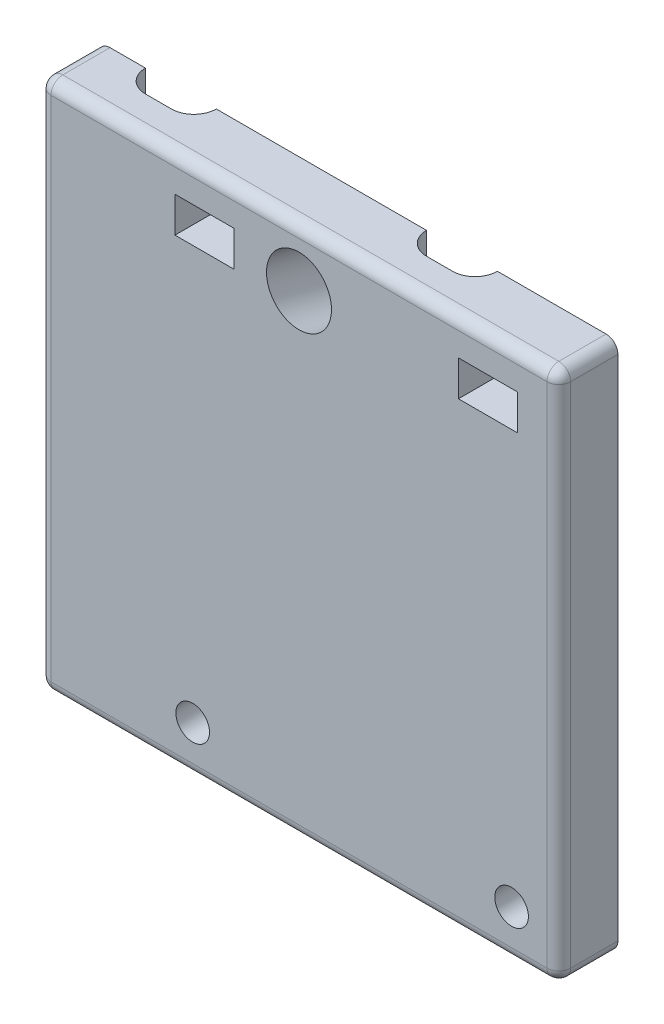
ISO-10303-21;
HEADER;
FILE_DESCRIPTION(('STEP AP214'),'2;1');
FILE_NAME('part.step','',(''),(''),'','','');
FILE_SCHEMA(('AUTOMOTIVE_DESIGN { 1 0 10303 214 1 1 1 1 }'));
ENDSEC;
DATA;
#1=APPLICATION_CONTEXT('core data for automotive mechanical design processes');
#2=APPLICATION_PROTOCOL_DEFINITION('international standard','automotive_design',2000,#1);
#3=PRODUCT_CONTEXT('',#1,'mechanical');
#4=PRODUCT('Part','Part','',(#3));
#5=PRODUCT_RELATED_PRODUCT_CATEGORY('part','',(#4));
#6=PRODUCT_DEFINITION_FORMATION('','',#4);
#7=PRODUCT_DEFINITION_CONTEXT('part definition',#1,'design');
#8=PRODUCT_DEFINITION('design','',#6,#7);
#9=PRODUCT_DEFINITION_SHAPE('','',#8);
#10=(LENGTH_UNIT() NAMED_UNIT(*) SI_UNIT(.MILLI.,.METRE.));
#11=(NAMED_UNIT(*) PLANE_ANGLE_UNIT() SI_UNIT($,.RADIAN.));
#12=(NAMED_UNIT(*) SI_UNIT($,.STERADIAN.) SOLID_ANGLE_UNIT());
#13=UNCERTAINTY_MEASURE_WITH_UNIT(LENGTH_MEASURE(1.E-05),#10,'distance_accuracy_value','');
#14=(GEOMETRIC_REPRESENTATION_CONTEXT(3) GLOBAL_UNCERTAINTY_ASSIGNED_CONTEXT((#13)) GLOBAL_UNIT_ASSIGNED_CONTEXT((#10,
#11,#12)) REPRESENTATION_CONTEXT('',''));
#15=CARTESIAN_POINT('',(0.,0.,0.));
#16=DIRECTION('',(0.,0.,1.));
#17=DIRECTION('',(1.,0.,0.));
#18=AXIS2_PLACEMENT_3D('',#15,#16,#17);
#19=CARTESIAN_POINT('',(0.,0.,0.));
#20=DIRECTION('',(0.,0.,1.));
#21=DIRECTION('',(1.,0.,0.));
#22=AXIS2_PLACEMENT_3D('',#19,#20,#21);
#23=PLANE('',#22);
#24=DIRECTION('',(1.,0.,0.));
#25=VECTOR('',#24,1.);
#26=CARTESIAN_POINT('',(-22.,-22.5,0.));
#27=LINE('',#26,#25);
#28=CARTESIAN_POINT('',(-21.,-22.5,0.));
#29=VERTEX_POINT('',#28);
#30=CARTESIAN_POINT('',(-18.,-22.5,0.));
#31=VERTEX_POINT('',#30);
#32=EDGE_CURVE('E356',#29,#31,#27,.T.);
#33=ORIENTED_EDGE('',*,*,#32,.F.);
#34=CARTESIAN_POINT('',(-21.,-21.5,0.));
#35=DIRECTION('',(0.,0.,1.));
#36=DIRECTION('',(1.,0.,0.));
#37=AXIS2_PLACEMENT_3D('',#34,#35,#36);
#38=CIRCLE('',#37,1.);
#39=CARTESIAN_POINT('',(-22.,-21.5,0.));
#40=VERTEX_POINT('',#39);
#41=EDGE_CURVE('E11',#29,#40,#38,.F.);
#42=ORIENTED_EDGE('',*,*,#41,.T.);
#43=DIRECTION('',(0.,-1.,0.));
#44=VECTOR('',#43,1.);
#45=CARTESIAN_POINT('',(-22.,22.5,0.));
#46=LINE('',#45,#44);
#47=CARTESIAN_POINT('',(-22.,21.5,0.));
#48=VERTEX_POINT('',#47);
#49=EDGE_CURVE('E351',#48,#40,#46,.T.);
#50=ORIENTED_EDGE('',*,*,#49,.F.);
#51=CARTESIAN_POINT('',(-21.,21.5,0.));
#52=DIRECTION('',(0.,0.,1.));
#53=DIRECTION('',(1.,0.,0.));
#54=AXIS2_PLACEMENT_3D('',#51,#52,#53);
#55=CIRCLE('',#54,1.);
#56=CARTESIAN_POINT('',(-21.,22.5,0.));
#57=VERTEX_POINT('',#56);
#58=EDGE_CURVE('E45',#48,#57,#55,.F.);
#59=ORIENTED_EDGE('',*,*,#58,.T.);
#60=DIRECTION('',(-1.,0.,0.));
#61=VECTOR('',#60,1.);
#62=CARTESIAN_POINT('',(-22.,22.5,0.));
#63=LINE('',#62,#61);
#64=CARTESIAN_POINT('',(-18.,22.5,0.));
#65=VERTEX_POINT('',#64);
#66=EDGE_CURVE('E348',#65,#57,#63,.T.);
#67=ORIENTED_EDGE('',*,*,#66,.F.);
#68=DIRECTION('',(0.,1.,0.));
#69=VECTOR('',#68,1.);
#70=CARTESIAN_POINT('',(-18.,-22.5,0.));
#71=LINE('',#70,#69);
#72=EDGE_CURVE('E312',#31,#65,#71,.T.);
#73=ORIENTED_EDGE('',*,*,#72,.F.);
#74=EDGE_LOOP('',(#33,#42,#50,#59,#67,#73));
#75=FACE_BOUND('',#74,.T.);
#76=ADVANCED_FACE('F36',(#75),#23,.F.);
#77=CARTESIAN_POINT('',(18.,-18.5,0.));
#78=DIRECTION('',(0.,0.,-1.));
#79=DIRECTION('',(-1.,0.,0.));
#80=AXIS2_PLACEMENT_3D('',#77,#78,#79);
#81=CIRCLE('',#80,1.425);
#82=CARTESIAN_POINT('',(16.575,-18.5,0.));
#83=VERTEX_POINT('',#82);
#84=EDGE_CURVE('E437',#83,#83,#81,.T.);
#85=ORIENTED_EDGE('',*,*,#84,.F.);
#86=EDGE_LOOP('',(#85));
#87=FACE_BOUND('',#86,.T.);
#88=DIRECTION('',(1.,0.,0.));
#89=VECTOR('',#88,1.);
#90=CARTESIAN_POINT('',(18.5,19.5,0.));
#91=LINE('',#90,#89);
#92=CARTESIAN_POINT('',(13.5,19.5,0.));
#93=VERTEX_POINT('',#92);
#94=CARTESIAN_POINT('',(18.5,19.5,0.));
#95=VERTEX_POINT('',#94);
#96=EDGE_CURVE('E275',#93,#95,#91,.T.);
#97=ORIENTED_EDGE('',*,*,#96,.F.);
#98=DIRECTION('',(0.,1.,0.));
#99=VECTOR('',#98,1.);
#100=CARTESIAN_POINT('',(13.5,19.5,0.));
#101=LINE('',#100,#99);
#102=CARTESIAN_POINT('',(13.5,16.5,0.));
#103=VERTEX_POINT('',#102);
#104=EDGE_CURVE('E247',#103,#93,#101,.T.);
#105=ORIENTED_EDGE('',*,*,#104,.F.);
#106=DIRECTION('',(-1.,0.,0.));
#107=VECTOR('',#106,1.);
#108=CARTESIAN_POINT('',(18.5,16.5,0.));
#109=LINE('',#108,#107);
#110=CARTESIAN_POINT('',(18.5,16.5,0.));
#111=VERTEX_POINT('',#110);
#112=EDGE_CURVE('E268',#111,#103,#109,.T.);
#113=ORIENTED_EDGE('',*,*,#112,.F.);
#114=DIRECTION('',(0.,-1.,0.));
#115=VECTOR('',#114,1.);
#116=CARTESIAN_POINT('',(18.5,19.5,0.));
#117=LINE('',#116,#115);
#118=EDGE_CURVE('E271',#95,#111,#117,.T.);
#119=ORIENTED_EDGE('',*,*,#118,.F.);
#120=EDGE_LOOP('',(#97,#105,#113,#119));
#121=FACE_BOUND('',#120,.T.);
#122=CARTESIAN_POINT('',(21.,22.5,0.));
#123=VERTEX_POINT('',#122);
#124=CARTESIAN_POINT('',(11.8,22.5,0.));
#125=VERTEX_POINT('',#124);
#126=EDGE_CURVE('E349',#123,#125,#63,.T.);
#127=ORIENTED_EDGE('',*,*,#126,.F.);
#128=CARTESIAN_POINT('',(21.,21.5,0.));
#129=DIRECTION('',(0.,0.,1.));
#130=DIRECTION('',(1.,0.,0.));
#131=AXIS2_PLACEMENT_3D('',#128,#129,#130);
#132=CIRCLE('',#131,1.);
#133=CARTESIAN_POINT('',(22.,21.5,0.));
#134=VERTEX_POINT('',#133);
#135=EDGE_CURVE('E395',#123,#134,#132,.F.);
#136=ORIENTED_EDGE('',*,*,#135,.T.);
#137=DIRECTION('',(0.,1.,0.));
#138=VECTOR('',#137,1.);
#139=CARTESIAN_POINT('',(22.,22.5,0.));
#140=LINE('',#139,#138);
#141=CARTESIAN_POINT('',(22.,-21.5,0.));
#142=VERTEX_POINT('',#141);
#143=EDGE_CURVE('E314',#142,#134,#140,.T.);
#144=ORIENTED_EDGE('',*,*,#143,.F.);
#145=CARTESIAN_POINT('',(21.,-21.5,0.));
#146=DIRECTION('',(0.,0.,1.));
#147=DIRECTION('',(1.,0.,0.));
#148=AXIS2_PLACEMENT_3D('',#145,#146,#147);
#149=CIRCLE('',#148,1.);
#150=CARTESIAN_POINT('',(21.,-22.5,0.));
#151=VERTEX_POINT('',#150);
#152=EDGE_CURVE('E393',#142,#151,#149,.F.);
#153=ORIENTED_EDGE('',*,*,#152,.T.);
#154=CARTESIAN_POINT('',(11.8,-22.5,0.));
#155=VERTEX_POINT('',#154);
#156=EDGE_CURVE('E355',#155,#151,#27,.T.);
#157=ORIENTED_EDGE('',*,*,#156,.F.);
#158=DIRECTION('',(0.,1.,0.));
#159=VECTOR('',#158,1.);
#160=CARTESIAN_POINT('',(11.8,-22.5,0.));
#161=LINE('',#160,#159);
#162=EDGE_CURVE('E321',#155,#125,#161,.T.);
#163=ORIENTED_EDGE('',*,*,#162,.T.);
#164=EDGE_LOOP('',(#127,#136,#144,#153,#157,#163));
#165=FACE_BOUND('',#164,.T.);
#166=ADVANCED_FACE('F454',(#87,#121,#165),#23,.F.);
#167=CARTESIAN_POINT('',(22.,22.5,5.));
#168=DIRECTION('',(-1.,0.,0.));
#169=DIRECTION('',(0.,-1.,0.));
#170=AXIS2_PLACEMENT_3D('',#167,#168,#169);
#171=PLANE('',#170);
#172=ORIENTED_EDGE('',*,*,#143,.T.);
#173=DIRECTION('',(0.,0.,-1.));
#174=VECTOR('',#173,1.);
#175=CARTESIAN_POINT('',(22.,21.5,5.));
#176=LINE('',#175,#174);
#177=CARTESIAN_POINT('',(22.,21.5,4.));
#178=VERTEX_POINT('',#177);
#179=EDGE_CURVE('E381',#134,#178,#176,.F.);
#180=ORIENTED_EDGE('',*,*,#179,.T.);
#181=DIRECTION('',(0.,1.,0.));
#182=VECTOR('',#181,1.);
#183=CARTESIAN_POINT('',(22.,-22.5,4.));
#184=LINE('',#183,#182);
#185=CARTESIAN_POINT('',(22.,-21.5,4.));
#186=VERTEX_POINT('',#185);
#187=EDGE_CURVE('E379',#178,#186,#184,.F.);
#188=ORIENTED_EDGE('',*,*,#187,.T.);
#189=DIRECTION('',(0.,0.,-1.));
#190=VECTOR('',#189,1.);
#191=CARTESIAN_POINT('',(22.,-21.5,5.));
#192=LINE('',#191,#190);
#193=EDGE_CURVE('E377',#186,#142,#192,.T.);
#194=ORIENTED_EDGE('',*,*,#193,.T.);
#195=EDGE_LOOP('',(#172,#180,#188,#194));
#196=FACE_BOUND('',#195,.T.);
#197=ADVANCED_FACE('F457',(#196),#171,.F.);
#198=CARTESIAN_POINT('',(-22.,22.5,5.));
#199=DIRECTION('',(0.,-1.,0.));
#200=DIRECTION('',(0.,0.,-1.));
#201=AXIS2_PLACEMENT_3D('',#198,#199,#200);
#202=PLANE('',#201);
#203=DIRECTION('',(-1.,0.,0.));
#204=VECTOR('',#203,1.);
#205=CARTESIAN_POINT('',(22.,22.5,4.));
#206=LINE('',#205,#204);
#207=CARTESIAN_POINT('',(-21.,22.5,4.));
#208=VERTEX_POINT('',#207);
#209=CARTESIAN_POINT('',(21.,22.5,4.));
#210=VERTEX_POINT('',#209);
#211=EDGE_CURVE('E53',#208,#210,#206,.F.);
#212=ORIENTED_EDGE('',*,*,#211,.T.);
#213=DIRECTION('',(0.,0.,-1.));
#214=VECTOR('',#213,1.);
#215=CARTESIAN_POINT('',(21.,22.5,5.));
#216=LINE('',#215,#214);
#217=EDGE_CURVE('E391',#210,#123,#216,.T.);
#218=ORIENTED_EDGE('',*,*,#217,.T.);
#219=ORIENTED_EDGE('',*,*,#126,.T.);
#220=CARTESIAN_POINT('',(9.9,22.5,0.));
#221=DIRECTION('',(0.,1.,0.));
#222=DIRECTION('',(0.,0.,1.));
#223=AXIS2_PLACEMENT_3D('',#220,#221,#222);
#224=CIRCLE('',#223,1.9);
#225=CARTESIAN_POINT('',(9.9,22.5,1.9));
#226=VERTEX_POINT('',#225);
#227=EDGE_CURVE('E308',#226,#125,#224,.T.);
#228=ORIENTED_EDGE('',*,*,#227,.F.);
#229=DIRECTION('',(1.,0.,0.));
#230=VECTOR('',#229,1.);
#231=CARTESIAN_POINT('',(9.9,22.5,1.9));
#232=LINE('',#231,#230);
#233=CARTESIAN_POINT('',(7.7,22.5,1.9));
#234=VERTEX_POINT('',#233);
#235=EDGE_CURVE('E330',#234,#226,#232,.T.);
#236=ORIENTED_EDGE('',*,*,#235,.F.);
#237=CARTESIAN_POINT('',(7.7,22.5,0.));
#238=DIRECTION('',(0.,1.,0.));
#239=DIRECTION('',(0.,0.,1.));
#240=AXIS2_PLACEMENT_3D('',#237,#238,#239);
#241=CIRCLE('',#240,1.9);
#242=CARTESIAN_POINT('',(5.8,22.5,0.));
#243=VERTEX_POINT('',#242);
#244=EDGE_CURVE('E333',#243,#234,#241,.T.);
#245=ORIENTED_EDGE('',*,*,#244,.F.);
#246=CARTESIAN_POINT('',(-12.,22.5,0.));
#247=VERTEX_POINT('',#246);
#248=EDGE_CURVE('E352',#243,#247,#63,.T.);
#249=ORIENTED_EDGE('',*,*,#248,.T.);
#250=CARTESIAN_POINT('',(-13.9,22.5,0.));
#251=DIRECTION('',(0.,1.,0.));
#252=DIRECTION('',(0.,0.,-1.));
#253=AXIS2_PLACEMENT_3D('',#250,#251,#252);
#254=CIRCLE('',#253,1.9);
#255=CARTESIAN_POINT('',(-13.9,22.5,1.9));
#256=VERTEX_POINT('',#255);
#257=EDGE_CURVE('E297',#256,#247,#254,.T.);
#258=ORIENTED_EDGE('',*,*,#257,.F.);
#259=DIRECTION('',(1.,0.,0.));
#260=VECTOR('',#259,1.);
#261=CARTESIAN_POINT('',(-16.1,22.5,1.9));
#262=LINE('',#261,#260);
#263=CARTESIAN_POINT('',(-16.1,22.5,1.9));
#264=VERTEX_POINT('',#263);
#265=EDGE_CURVE('E307',#264,#256,#262,.T.);
#266=ORIENTED_EDGE('',*,*,#265,.F.);
#267=CARTESIAN_POINT('',(-16.1,22.5,0.));
#268=DIRECTION('',(0.,1.,0.));
#269=DIRECTION('',(0.,0.,-1.));
#270=AXIS2_PLACEMENT_3D('',#267,#268,#269);
#271=CIRCLE('',#270,1.9);
#272=EDGE_CURVE('E304',#65,#264,#271,.T.);
#273=ORIENTED_EDGE('',*,*,#272,.F.);
#274=ORIENTED_EDGE('',*,*,#66,.T.);
#275=DIRECTION('',(0.,0.,-1.));
#276=VECTOR('',#275,1.);
#277=CARTESIAN_POINT('',(-21.,22.5,5.));
#278=LINE('',#277,#276);
#279=EDGE_CURVE('E58',#57,#208,#278,.F.);
#280=ORIENTED_EDGE('',*,*,#279,.T.);
#281=EDGE_LOOP('',(#212,#218,#219,#228,#236,#245,#249,#258,#266,#273,#274,#280));
#282=FACE_BOUND('',#281,.T.);
#283=ADVANCED_FACE('F502',(#282),#202,.F.);
#284=CARTESIAN_POINT('',(-22.,22.5,5.));
#285=DIRECTION('',(1.,0.,0.));
#286=DIRECTION('',(0.,1.,0.));
#287=AXIS2_PLACEMENT_3D('',#284,#285,#286);
#288=PLANE('',#287);
#289=ORIENTED_EDGE('',*,*,#49,.T.);
#290=DIRECTION('',(0.,0.,-1.));
#291=VECTOR('',#290,1.);
#292=CARTESIAN_POINT('',(-22.,-21.5,5.));
#293=LINE('',#292,#291);
#294=CARTESIAN_POINT('',(-22.,-21.5,4.));
#295=VERTEX_POINT('',#294);
#296=EDGE_CURVE('E375',#40,#295,#293,.F.);
#297=ORIENTED_EDGE('',*,*,#296,.T.);
#298=DIRECTION('',(0.,-1.,0.));
#299=VECTOR('',#298,1.);
#300=CARTESIAN_POINT('',(-22.,22.5,4.));
#301=LINE('',#300,#299);
#302=CARTESIAN_POINT('',(-22.,21.5,4.));
#303=VERTEX_POINT('',#302);
#304=EDGE_CURVE('E372',#295,#303,#301,.F.);
#305=ORIENTED_EDGE('',*,*,#304,.T.);
#306=DIRECTION('',(0.,0.,-1.));
#307=VECTOR('',#306,1.);
#308=CARTESIAN_POINT('',(-22.,21.5,5.));
#309=LINE('',#308,#307);
#310=EDGE_CURVE('E370',#303,#48,#309,.T.);
#311=ORIENTED_EDGE('',*,*,#310,.T.);
#312=EDGE_LOOP('',(#289,#297,#305,#311));
#313=FACE_BOUND('',#312,.T.);
#314=ADVANCED_FACE('F528',(#313),#288,.F.);
#315=CARTESIAN_POINT('',(-22.,-22.5,5.));
#316=DIRECTION('',(0.,1.,0.));
#317=DIRECTION('',(0.,0.,1.));
#318=AXIS2_PLACEMENT_3D('',#315,#316,#317);
#319=PLANE('',#318);
#320=ORIENTED_EDGE('',*,*,#156,.T.);
#321=DIRECTION('',(0.,0.,-1.));
#322=VECTOR('',#321,1.);
#323=CARTESIAN_POINT('',(21.,-22.5,5.));
#324=LINE('',#323,#322);
#325=CARTESIAN_POINT('',(21.,-22.5,4.));
#326=VERTEX_POINT('',#325);
#327=EDGE_CURVE('E387',#151,#326,#324,.F.);
#328=ORIENTED_EDGE('',*,*,#327,.T.);
#329=DIRECTION('',(1.,0.,0.));
#330=VECTOR('',#329,1.);
#331=CARTESIAN_POINT('',(-22.,-22.5,4.));
#332=LINE('',#331,#330);
#333=CARTESIAN_POINT('',(-21.,-22.5,4.));
#334=VERTEX_POINT('',#333);
#335=EDGE_CURVE('E385',#326,#334,#332,.F.);
#336=ORIENTED_EDGE('',*,*,#335,.T.);
#337=DIRECTION('',(0.,0.,-1.));
#338=VECTOR('',#337,1.);
#339=CARTESIAN_POINT('',(-21.,-22.5,5.));
#340=LINE('',#339,#338);
#341=EDGE_CURVE('E383',#334,#29,#340,.T.);
#342=ORIENTED_EDGE('',*,*,#341,.T.);
#343=ORIENTED_EDGE('',*,*,#32,.T.);
#344=CARTESIAN_POINT('',(-16.1,-22.5,0.));
#345=DIRECTION('',(0.,1.,0.));
#346=DIRECTION('',(0.,0.,-1.));
#347=AXIS2_PLACEMENT_3D('',#344,#345,#346);
#348=CIRCLE('',#347,1.9);
#349=CARTESIAN_POINT('',(-16.1,-22.5,1.9));
#350=VERTEX_POINT('',#349);
#351=EDGE_CURVE('E293',#31,#350,#348,.T.);
#352=ORIENTED_EDGE('',*,*,#351,.T.);
#353=DIRECTION('',(1.,0.,0.));
#354=VECTOR('',#353,1.);
#355=CARTESIAN_POINT('',(-16.1,-22.5,1.9));
#356=LINE('',#355,#354);
#357=CARTESIAN_POINT('',(-13.9,-22.5,1.9));
#358=VERTEX_POINT('',#357);
#359=EDGE_CURVE('E296',#350,#358,#356,.T.);
#360=ORIENTED_EDGE('',*,*,#359,.T.);
#361=CARTESIAN_POINT('',(-13.9,-22.5,0.));
#362=DIRECTION('',(0.,1.,0.));
#363=DIRECTION('',(0.,0.,-1.));
#364=AXIS2_PLACEMENT_3D('',#361,#362,#363);
#365=CIRCLE('',#364,1.9);
#366=CARTESIAN_POINT('',(-12.,-22.5,0.));
#367=VERTEX_POINT('',#366);
#368=EDGE_CURVE('E300',#358,#367,#365,.T.);
#369=ORIENTED_EDGE('',*,*,#368,.T.);
#370=CARTESIAN_POINT('',(5.8,-22.5,0.));
#371=VERTEX_POINT('',#370);
#372=EDGE_CURVE('E359',#367,#371,#27,.T.);
#373=ORIENTED_EDGE('',*,*,#372,.T.);
#374=CARTESIAN_POINT('',(7.7,-22.5,0.));
#375=DIRECTION('',(0.,1.,0.));
#376=DIRECTION('',(0.,0.,1.));
#377=AXIS2_PLACEMENT_3D('',#374,#375,#376);
#378=CIRCLE('',#377,1.9);
#379=CARTESIAN_POINT('',(7.7,-22.5,1.9));
#380=VERTEX_POINT('',#379);
#381=EDGE_CURVE('E341',#371,#380,#378,.T.);
#382=ORIENTED_EDGE('',*,*,#381,.T.);
#383=DIRECTION('',(1.,0.,0.));
#384=VECTOR('',#383,1.);
#385=CARTESIAN_POINT('',(9.9,-22.5,1.9));
#386=LINE('',#385,#384);
#387=CARTESIAN_POINT('',(9.9,-22.5,1.9));
#388=VERTEX_POINT('',#387);
#389=EDGE_CURVE('E324',#380,#388,#386,.T.);
#390=ORIENTED_EDGE('',*,*,#389,.T.);
#391=CARTESIAN_POINT('',(9.9,-22.5,0.));
#392=DIRECTION('',(0.,1.,0.));
#393=DIRECTION('',(0.,0.,1.));
#394=AXIS2_PLACEMENT_3D('',#391,#392,#393);
#395=CIRCLE('',#394,1.9);
#396=EDGE_CURVE('E334',#388,#155,#395,.T.);
#397=ORIENTED_EDGE('',*,*,#396,.T.);
#398=EDGE_LOOP('',(#320,#328,#336,#342,#343,#352,#360,#369,#373,#382,#390,#397));
#399=FACE_BOUND('',#398,.T.);
#400=ADVANCED_FACE('F489',(#399),#319,.F.);
#401=CARTESIAN_POINT('',(0.,0.,5.));
#402=DIRECTION('',(0.,0.,1.));
#403=DIRECTION('',(1.,0.,0.));
#404=AXIS2_PLACEMENT_3D('',#401,#402,#403);
#405=PLANE('',#404);
#406=DIRECTION('',(0.,-1.,0.));
#407=VECTOR('',#406,1.);
#408=CARTESIAN_POINT('',(-21.,-22.5,5.));
#409=LINE('',#408,#407);
#410=CARTESIAN_POINT('',(-21.,21.5,5.));
#411=VERTEX_POINT('',#410);
#412=CARTESIAN_POINT('',(-21.,-21.5,5.));
#413=VERTEX_POINT('',#412);
#414=EDGE_CURVE('E365',#411,#413,#409,.T.);
#415=ORIENTED_EDGE('',*,*,#414,.T.);
#416=DIRECTION('',(1.,0.,0.));
#417=VECTOR('',#416,1.);
#418=CARTESIAN_POINT('',(22.,-21.5,5.));
#419=LINE('',#418,#417);
#420=CARTESIAN_POINT('',(21.,-21.5,5.));
#421=VERTEX_POINT('',#420);
#422=EDGE_CURVE('E368',#413,#421,#419,.T.);
#423=ORIENTED_EDGE('',*,*,#422,.T.);
#424=DIRECTION('',(0.,1.,0.));
#425=VECTOR('',#424,1.);
#426=CARTESIAN_POINT('',(21.,22.5,5.));
#427=LINE('',#426,#425);
#428=CARTESIAN_POINT('',(21.,21.5,5.));
#429=VERTEX_POINT('',#428);
#430=EDGE_CURVE('E363',#421,#429,#427,.T.);
#431=ORIENTED_EDGE('',*,*,#430,.T.);
#432=DIRECTION('',(-1.,0.,0.));
#433=VECTOR('',#432,1.);
#434=CARTESIAN_POINT('',(-22.,21.5,5.));
#435=LINE('',#434,#433);
#436=EDGE_CURVE('E358',#429,#411,#435,.T.);
#437=ORIENTED_EDGE('',*,*,#436,.T.);
#438=EDGE_LOOP('',(#415,#423,#431,#437));
#439=FACE_BOUND('',#438,.T.);
#440=CARTESIAN_POINT('',(18.,-18.5,5.));
#441=DIRECTION('',(0.,0.,-1.));
#442=DIRECTION('',(-1.,0.,0.));
#443=AXIS2_PLACEMENT_3D('',#440,#441,#442);
#444=CIRCLE('',#443,1.425);
#445=CARTESIAN_POINT('',(16.575,-18.5,5.));
#446=VERTEX_POINT('',#445);
#447=EDGE_CURVE('E267',#446,#446,#444,.T.);
#448=ORIENTED_EDGE('',*,*,#447,.T.);
#449=EDGE_LOOP('',(#448));
#450=FACE_BOUND('',#449,.T.);
#451=CARTESIAN_POINT('',(-9.00000000000001,-18.5,5.));
#452=DIRECTION('',(0.,0.,-1.));
#453=DIRECTION('',(1.,0.,0.));
#454=AXIS2_PLACEMENT_3D('',#451,#452,#453);
#455=CIRCLE('',#454,1.425);
#456=CARTESIAN_POINT('',(-7.57500000000001,-18.5,5.));
#457=VERTEX_POINT('',#456);
#458=EDGE_CURVE('E240',#457,#457,#455,.T.);
#459=ORIENTED_EDGE('',*,*,#458,.T.);
#460=EDGE_LOOP('',(#459));
#461=FACE_BOUND('',#460,.T.);
#462=DIRECTION('',(0.,1.,0.));
#463=VECTOR('',#462,1.);
#464=CARTESIAN_POINT('',(-10.5,19.5,5.));
#465=LINE('',#464,#463);
#466=CARTESIAN_POINT('',(-10.5,16.5,5.));
#467=VERTEX_POINT('',#466);
#468=CARTESIAN_POINT('',(-10.5,19.5,5.));
#469=VERTEX_POINT('',#468);
#470=EDGE_CURVE('E213',#467,#469,#465,.T.);
#471=ORIENTED_EDGE('',*,*,#470,.T.);
#472=DIRECTION('',(1.,0.,0.));
#473=VECTOR('',#472,1.);
#474=CARTESIAN_POINT('',(-10.5,19.5,5.));
#475=LINE('',#474,#473);
#476=CARTESIAN_POINT('',(-5.5,19.5,5.));
#477=VERTEX_POINT('',#476);
#478=EDGE_CURVE('E225',#469,#477,#475,.T.);
#479=ORIENTED_EDGE('',*,*,#478,.T.);
#480=DIRECTION('',(0.,-1.,0.));
#481=VECTOR('',#480,1.);
#482=CARTESIAN_POINT('',(-5.5,19.5,5.));
#483=LINE('',#482,#481);
#484=CARTESIAN_POINT('',(-5.5,16.5,5.));
#485=VERTEX_POINT('',#484);
#486=EDGE_CURVE('E229',#477,#485,#483,.T.);
#487=ORIENTED_EDGE('',*,*,#486,.T.);
#488=DIRECTION('',(-1.,0.,0.));
#489=VECTOR('',#488,1.);
#490=CARTESIAN_POINT('',(-10.5,16.5,5.));
#491=LINE('',#490,#489);
#492=EDGE_CURVE('E221',#485,#467,#491,.T.);
#493=ORIENTED_EDGE('',*,*,#492,.T.);
#494=EDGE_LOOP('',(#471,#479,#487,#493));
#495=FACE_BOUND('',#494,.T.);
#496=DIRECTION('',(0.,1.,0.));
#497=VECTOR('',#496,1.);
#498=CARTESIAN_POINT('',(13.5,19.5,5.));
#499=LINE('',#498,#497);
#500=CARTESIAN_POINT('',(13.5,16.5,5.));
#501=VERTEX_POINT('',#500);
#502=CARTESIAN_POINT('',(13.5,19.5,5.));
#503=VERTEX_POINT('',#502);
#504=EDGE_CURVE('E272',#501,#503,#499,.T.);
#505=ORIENTED_EDGE('',*,*,#504,.T.);
#506=DIRECTION('',(1.,0.,0.));
#507=VECTOR('',#506,1.);
#508=CARTESIAN_POINT('',(18.5,19.5,5.));
#509=LINE('',#508,#507);
#510=CARTESIAN_POINT('',(18.5,19.5,5.));
#511=VERTEX_POINT('',#510);
#512=EDGE_CURVE('E284',#503,#511,#509,.T.);
#513=ORIENTED_EDGE('',*,*,#512,.T.);
#514=DIRECTION('',(0.,-1.,0.));
#515=VECTOR('',#514,1.);
#516=CARTESIAN_POINT('',(18.5,19.5,5.));
#517=LINE('',#516,#515);
#518=CARTESIAN_POINT('',(18.5,16.5,5.));
#519=VERTEX_POINT('',#518);
#520=EDGE_CURVE('E281',#511,#519,#517,.T.);
#521=ORIENTED_EDGE('',*,*,#520,.T.);
#522=DIRECTION('',(-1.,0.,0.));
#523=VECTOR('',#522,1.);
#524=CARTESIAN_POINT('',(18.5,16.5,5.));
#525=LINE('',#524,#523);
#526=EDGE_CURVE('E260',#519,#501,#525,.T.);
#527=ORIENTED_EDGE('',*,*,#526,.T.);
#528=EDGE_LOOP('',(#505,#513,#521,#527));
#529=FACE_BOUND('',#528,.T.);
#530=CARTESIAN_POINT('',(0.,17.6582599334208,5.));
#531=DIRECTION('',(0.,0.,1.));
#532=DIRECTION('',(0.,-1.,0.));
#533=AXIS2_PLACEMENT_3D('',#530,#531,#532);
#534=ELLIPSE('',#533,2.84700949612773,2.75);
#535=CARTESIAN_POINT('',(0.,14.8112504372931,5.));
#536=VERTEX_POINT('',#535);
#537=EDGE_CURVE('E289',#536,#536,#534,.T.);
#538=ORIENTED_EDGE('',*,*,#537,.F.);
#539=EDGE_LOOP('',(#538));
#540=FACE_BOUND('',#539,.T.);
#541=ADVANCED_FACE('F231',(#439,#450,#461,#495,#529,#540),#405,.T.);
#542=CARTESIAN_POINT('',(-9.00000000000001,-18.5,0.));
#543=DIRECTION('',(0.,0.,-1.));
#544=DIRECTION('',(1.,0.,0.));
#545=AXIS2_PLACEMENT_3D('',#542,#543,#544);
#546=CIRCLE('',#545,1.425);
#547=CARTESIAN_POINT('',(-7.57500000000001,-18.5,0.));
#548=VERTEX_POINT('',#547);
#549=EDGE_CURVE('E433',#548,#548,#546,.T.);
#550=ORIENTED_EDGE('',*,*,#549,.F.);
#551=EDGE_LOOP('',(#550));
#552=FACE_BOUND('',#551,.T.);
#553=DIRECTION('',(1.,0.,0.));
#554=VECTOR('',#553,1.);
#555=CARTESIAN_POINT('',(-10.5,19.5,0.));
#556=LINE('',#555,#554);
#557=CARTESIAN_POINT('',(-10.5,19.5,0.));
#558=VERTEX_POINT('',#557);
#559=CARTESIAN_POINT('',(-5.5,19.5,0.));
#560=VERTEX_POINT('',#559);
#561=EDGE_CURVE('E246',#558,#560,#556,.T.);
#562=ORIENTED_EDGE('',*,*,#561,.F.);
#563=DIRECTION('',(0.,1.,0.));
#564=VECTOR('',#563,1.);
#565=CARTESIAN_POINT('',(-10.5,19.5,0.));
#566=LINE('',#565,#564);
#567=CARTESIAN_POINT('',(-10.5,16.5,0.));
#568=VERTEX_POINT('',#567);
#569=EDGE_CURVE('E216',#568,#558,#566,.T.);
#570=ORIENTED_EDGE('',*,*,#569,.F.);
#571=DIRECTION('',(-1.,0.,0.));
#572=VECTOR('',#571,1.);
#573=CARTESIAN_POINT('',(-10.5,16.5,0.));
#574=LINE('',#573,#572);
#575=CARTESIAN_POINT('',(-5.5,16.5,0.));
#576=VERTEX_POINT('',#575);
#577=EDGE_CURVE('E234',#576,#568,#574,.T.);
#578=ORIENTED_EDGE('',*,*,#577,.F.);
#579=DIRECTION('',(0.,-1.,0.));
#580=VECTOR('',#579,1.);
#581=CARTESIAN_POINT('',(-5.5,19.5,0.));
#582=LINE('',#581,#580);
#583=EDGE_CURVE('E237',#560,#576,#582,.T.);
#584=ORIENTED_EDGE('',*,*,#583,.F.);
#585=EDGE_LOOP('',(#562,#570,#578,#584));
#586=FACE_BOUND('',#585,.T.);
#587=CARTESIAN_POINT('',(0.,16.3185139712652,0.));
#588=DIRECTION('',(0.,0.,1.));
#589=DIRECTION('',(0.,-1.,0.));
#590=AXIS2_PLACEMENT_3D('',#587,#588,#589);
#591=ELLIPSE('',#590,2.84700949612773,2.75);
#592=CARTESIAN_POINT('',(0.,13.4715044751375,0.));
#593=VERTEX_POINT('',#592);
#594=EDGE_CURVE('E253',#593,#593,#591,.T.);
#595=ORIENTED_EDGE('',*,*,#594,.T.);
#596=EDGE_LOOP('',(#595));
#597=FACE_BOUND('',#596,.T.);
#598=ORIENTED_EDGE('',*,*,#372,.F.);
#599=DIRECTION('',(0.,1.,0.));
#600=VECTOR('',#599,1.);
#601=CARTESIAN_POINT('',(-12.,-22.5,0.));
#602=LINE('',#601,#600);
#603=EDGE_CURVE('E315',#367,#247,#602,.T.);
#604=ORIENTED_EDGE('',*,*,#603,.T.);
#605=ORIENTED_EDGE('',*,*,#248,.F.);
#606=DIRECTION('',(0.,1.,0.));
#607=VECTOR('',#606,1.);
#608=CARTESIAN_POINT('',(5.8,-22.5,0.));
#609=LINE('',#608,#607);
#610=EDGE_CURVE('E325',#371,#243,#609,.T.);
#611=ORIENTED_EDGE('',*,*,#610,.F.);
#612=EDGE_LOOP('',(#598,#604,#605,#611));
#613=FACE_BOUND('',#612,.T.);
#614=ADVANCED_FACE('F459',(#552,#586,#597,#613),#23,.F.);
#615=CARTESIAN_POINT('',(9.9,-22.5,0.));
#616=DIRECTION('',(0.,1.,0.));
#617=DIRECTION('',(0.,0.,1.));
#618=AXIS2_PLACEMENT_3D('',#615,#616,#617);
#619=CYLINDRICAL_SURFACE('',#618,1.9);
#620=ORIENTED_EDGE('',*,*,#227,.T.);
#621=ORIENTED_EDGE('',*,*,#162,.F.);
#622=ORIENTED_EDGE('',*,*,#396,.F.);
#623=DIRECTION('',(0.,1.,0.));
#624=VECTOR('',#623,1.);
#625=CARTESIAN_POINT('',(9.9,-22.5,1.9));
#626=LINE('',#625,#624);
#627=EDGE_CURVE('E292',#388,#226,#626,.T.);
#628=ORIENTED_EDGE('',*,*,#627,.T.);
#629=EDGE_LOOP('',(#620,#621,#622,#628));
#630=FACE_BOUND('',#629,.T.);
#631=ADVANCED_FACE('F508',(#630),#619,.F.);
#632=CARTESIAN_POINT('',(9.9,-22.5,1.9));
#633=DIRECTION('',(0.,0.,1.));
#634=DIRECTION('',(1.,0.,0.));
#635=AXIS2_PLACEMENT_3D('',#632,#633,#634);
#636=PLANE('',#635);
#637=ORIENTED_EDGE('',*,*,#235,.T.);
#638=ORIENTED_EDGE('',*,*,#627,.F.);
#639=ORIENTED_EDGE('',*,*,#389,.F.);
#640=DIRECTION('',(0.,1.,0.));
#641=VECTOR('',#640,1.);
#642=CARTESIAN_POINT('',(7.7,-22.5,1.9));
#643=LINE('',#642,#641);
#644=EDGE_CURVE('E327',#380,#234,#643,.T.);
#645=ORIENTED_EDGE('',*,*,#644,.T.);
#646=EDGE_LOOP('',(#637,#638,#639,#645));
#647=FACE_BOUND('',#646,.T.);
#648=ADVANCED_FACE('F505',(#647),#636,.F.);
#649=CARTESIAN_POINT('',(7.7,-22.5,0.));
#650=DIRECTION('',(0.,1.,0.));
#651=DIRECTION('',(0.,0.,1.));
#652=AXIS2_PLACEMENT_3D('',#649,#650,#651);
#653=CYLINDRICAL_SURFACE('',#652,1.9);
#654=ORIENTED_EDGE('',*,*,#244,.T.);
#655=ORIENTED_EDGE('',*,*,#644,.F.);
#656=ORIENTED_EDGE('',*,*,#381,.F.);
#657=ORIENTED_EDGE('',*,*,#610,.T.);
#658=EDGE_LOOP('',(#654,#655,#656,#657));
#659=FACE_BOUND('',#658,.T.);
#660=ADVANCED_FACE('F500',(#659),#653,.F.);
#661=CARTESIAN_POINT('',(-16.1,-22.5,0.));
#662=DIRECTION('',(0.,1.,0.));
#663=DIRECTION('',(0.,0.,1.));
#664=AXIS2_PLACEMENT_3D('',#661,#662,#663);
#665=CYLINDRICAL_SURFACE('',#664,1.9);
#666=ORIENTED_EDGE('',*,*,#272,.T.);
#667=DIRECTION('',(0.,1.,0.));
#668=VECTOR('',#667,1.);
#669=CARTESIAN_POINT('',(-16.1,-22.5,1.9));
#670=LINE('',#669,#668);
#671=EDGE_CURVE('E303',#350,#264,#670,.T.);
#672=ORIENTED_EDGE('',*,*,#671,.F.);
#673=ORIENTED_EDGE('',*,*,#351,.F.);
#674=ORIENTED_EDGE('',*,*,#72,.T.);
#675=EDGE_LOOP('',(#666,#672,#673,#674));
#676=FACE_BOUND('',#675,.T.);
#677=ADVANCED_FACE('F672',(#676),#665,.F.);
#678=CARTESIAN_POINT('',(-13.9,-22.5,0.));
#679=DIRECTION('',(0.,1.,0.));
#680=DIRECTION('',(0.,0.,1.));
#681=AXIS2_PLACEMENT_3D('',#678,#679,#680);
#682=CYLINDRICAL_SURFACE('',#681,1.9);
#683=ORIENTED_EDGE('',*,*,#257,.T.);
#684=ORIENTED_EDGE('',*,*,#603,.F.);
#685=ORIENTED_EDGE('',*,*,#368,.F.);
#686=DIRECTION('',(0.,1.,0.));
#687=VECTOR('',#686,1.);
#688=CARTESIAN_POINT('',(-13.9,-22.5,1.9));
#689=LINE('',#688,#687);
#690=EDGE_CURVE('E318',#358,#256,#689,.T.);
#691=ORIENTED_EDGE('',*,*,#690,.T.);
#692=EDGE_LOOP('',(#683,#684,#685,#691));
#693=FACE_BOUND('',#692,.T.);
#694=ADVANCED_FACE('F664',(#693),#682,.F.);
#695=CARTESIAN_POINT('',(-16.1,-22.5,1.9));
#696=DIRECTION('',(0.,0.,1.));
#697=DIRECTION('',(1.,0.,0.));
#698=AXIS2_PLACEMENT_3D('',#695,#696,#697);
#699=PLANE('',#698);
#700=ORIENTED_EDGE('',*,*,#265,.T.);
#701=ORIENTED_EDGE('',*,*,#690,.F.);
#702=ORIENTED_EDGE('',*,*,#359,.F.);
#703=ORIENTED_EDGE('',*,*,#671,.T.);
#704=EDGE_LOOP('',(#700,#701,#702,#703));
#705=FACE_BOUND('',#704,.T.);
#706=ADVANCED_FACE('F656',(#705),#699,.F.);
#707=CARTESIAN_POINT('',(0.,17.9825950186211,6.2104350166448));
#708=DIRECTION('',(0.,-0.258819045102521,-0.965925826289068));
#709=DIRECTION('',(0.,0.965925826289068,-0.258819045102521));
#710=AXIS2_PLACEMENT_3D('',#707,#708,#709);
#711=CYLINDRICAL_SURFACE('',#710,2.75);
#712=ORIENTED_EDGE('',*,*,#537,.T.);
#713=EDGE_LOOP('',(#712));
#714=FACE_BOUND('',#713,.T.);
#715=ORIENTED_EDGE('',*,*,#594,.F.);
#716=EDGE_LOOP('',(#715));
#717=FACE_BOUND('',#716,.T.);
#718=ADVANCED_FACE('F649',(#714,#717),#711,.F.);
#719=CARTESIAN_POINT('',(-10.5,19.5,5.));
#720=DIRECTION('',(-1.,0.,0.));
#721=DIRECTION('',(0.,0.,1.));
#722=AXIS2_PLACEMENT_3D('',#719,#720,#721);
#723=PLANE('',#722);
#724=ORIENTED_EDGE('',*,*,#569,.T.);
#725=DIRECTION('',(0.,0.,-1.));
#726=VECTOR('',#725,1.);
#727=CARTESIAN_POINT('',(-10.5,19.5,5.));
#728=LINE('',#727,#726);
#729=EDGE_CURVE('E209',#469,#558,#728,.T.);
#730=ORIENTED_EDGE('',*,*,#729,.F.);
#731=ORIENTED_EDGE('',*,*,#470,.F.);
#732=DIRECTION('',(0.,0.,-1.));
#733=VECTOR('',#732,1.);
#734=CARTESIAN_POINT('',(-10.5,16.5,5.));
#735=LINE('',#734,#733);
#736=EDGE_CURVE('E251',#467,#568,#735,.T.);
#737=ORIENTED_EDGE('',*,*,#736,.T.);
#738=EDGE_LOOP('',(#724,#730,#731,#737));
#739=FACE_BOUND('',#738,.T.);
#740=ADVANCED_FACE('F211',(#739),#723,.F.);
#741=CARTESIAN_POINT('',(-10.5,16.5,5.));
#742=DIRECTION('',(0.,-1.,0.));
#743=DIRECTION('',(0.,0.,-1.));
#744=AXIS2_PLACEMENT_3D('',#741,#742,#743);
#745=PLANE('',#744);
#746=ORIENTED_EDGE('',*,*,#577,.T.);
#747=ORIENTED_EDGE('',*,*,#736,.F.);
#748=ORIENTED_EDGE('',*,*,#492,.F.);
#749=DIRECTION('',(0.,0.,-1.));
#750=VECTOR('',#749,1.);
#751=CARTESIAN_POINT('',(-5.5,16.5,5.));
#752=LINE('',#751,#750);
#753=EDGE_CURVE('E254',#485,#576,#752,.T.);
#754=ORIENTED_EDGE('',*,*,#753,.T.);
#755=EDGE_LOOP('',(#746,#747,#748,#754));
#756=FACE_BOUND('',#755,.T.);
#757=ADVANCED_FACE('F634',(#756),#745,.F.);
#758=CARTESIAN_POINT('',(-5.5,19.5,5.));
#759=DIRECTION('',(1.,0.,0.));
#760=DIRECTION('',(0.,0.,-1.));
#761=AXIS2_PLACEMENT_3D('',#758,#759,#760);
#762=PLANE('',#761);
#763=ORIENTED_EDGE('',*,*,#583,.T.);
#764=ORIENTED_EDGE('',*,*,#753,.F.);
#765=ORIENTED_EDGE('',*,*,#486,.F.);
#766=DIRECTION('',(0.,0.,-1.));
#767=VECTOR('',#766,1.);
#768=CARTESIAN_POINT('',(-5.5,19.5,5.));
#769=LINE('',#768,#767);
#770=EDGE_CURVE('E220',#477,#560,#769,.T.);
#771=ORIENTED_EDGE('',*,*,#770,.T.);
#772=EDGE_LOOP('',(#763,#764,#765,#771));
#773=FACE_BOUND('',#772,.T.);
#774=ADVANCED_FACE('F627',(#773),#762,.F.);
#775=CARTESIAN_POINT('',(-10.5,19.5,5.));
#776=DIRECTION('',(0.,1.,0.));
#777=DIRECTION('',(0.,0.,1.));
#778=AXIS2_PLACEMENT_3D('',#775,#776,#777);
#779=PLANE('',#778);
#780=ORIENTED_EDGE('',*,*,#561,.T.);
#781=ORIENTED_EDGE('',*,*,#770,.F.);
#782=ORIENTED_EDGE('',*,*,#478,.F.);
#783=ORIENTED_EDGE('',*,*,#729,.T.);
#784=EDGE_LOOP('',(#780,#781,#782,#783));
#785=FACE_BOUND('',#784,.T.);
#786=ADVANCED_FACE('F226',(#785),#779,.F.);
#787=CARTESIAN_POINT('',(13.5,19.5,5.));
#788=DIRECTION('',(-1.,0.,0.));
#789=DIRECTION('',(0.,0.,1.));
#790=AXIS2_PLACEMENT_3D('',#787,#788,#789);
#791=PLANE('',#790);
#792=ORIENTED_EDGE('',*,*,#104,.T.);
#793=DIRECTION('',(0.,0.,-1.));
#794=VECTOR('',#793,1.);
#795=CARTESIAN_POINT('',(13.5,19.5,5.));
#796=LINE('',#795,#794);
#797=EDGE_CURVE('E257',#503,#93,#796,.T.);
#798=ORIENTED_EDGE('',*,*,#797,.F.);
#799=ORIENTED_EDGE('',*,*,#504,.F.);
#800=DIRECTION('',(0.,0.,-1.));
#801=VECTOR('',#800,1.);
#802=CARTESIAN_POINT('',(13.5,16.5,5.));
#803=LINE('',#802,#801);
#804=EDGE_CURVE('E265',#501,#103,#803,.T.);
#805=ORIENTED_EDGE('',*,*,#804,.T.);
#806=EDGE_LOOP('',(#792,#798,#799,#805));
#807=FACE_BOUND('',#806,.T.);
#808=ADVANCED_FACE('F612',(#807),#791,.F.);
#809=CARTESIAN_POINT('',(18.5,16.5,5.));
#810=DIRECTION('',(0.,-1.,0.));
#811=DIRECTION('',(0.,0.,-1.));
#812=AXIS2_PLACEMENT_3D('',#809,#810,#811);
#813=PLANE('',#812);
#814=ORIENTED_EDGE('',*,*,#112,.T.);
#815=ORIENTED_EDGE('',*,*,#804,.F.);
#816=ORIENTED_EDGE('',*,*,#526,.F.);
#817=DIRECTION('',(0.,0.,-1.));
#818=VECTOR('',#817,1.);
#819=CARTESIAN_POINT('',(18.5,16.5,5.));
#820=LINE('',#819,#818);
#821=EDGE_CURVE('E263',#519,#111,#820,.T.);
#822=ORIENTED_EDGE('',*,*,#821,.T.);
#823=EDGE_LOOP('',(#814,#815,#816,#822));
#824=FACE_BOUND('',#823,.T.);
#825=ADVANCED_FACE('F604',(#824),#813,.F.);
#826=CARTESIAN_POINT('',(18.5,19.5,5.));
#827=DIRECTION('',(1.,0.,0.));
#828=DIRECTION('',(0.,0.,-1.));
#829=AXIS2_PLACEMENT_3D('',#826,#827,#828);
#830=PLANE('',#829);
#831=ORIENTED_EDGE('',*,*,#118,.T.);
#832=ORIENTED_EDGE('',*,*,#821,.F.);
#833=ORIENTED_EDGE('',*,*,#520,.F.);
#834=DIRECTION('',(0.,0.,-1.));
#835=VECTOR('',#834,1.);
#836=CARTESIAN_POINT('',(18.5,19.5,5.));
#837=LINE('',#836,#835);
#838=EDGE_CURVE('E261',#511,#95,#837,.T.);
#839=ORIENTED_EDGE('',*,*,#838,.T.);
#840=EDGE_LOOP('',(#831,#832,#833,#839));
#841=FACE_BOUND('',#840,.T.);
#842=ADVANCED_FACE('F596',(#841),#830,.F.);
#843=CARTESIAN_POINT('',(18.5,19.5,5.));
#844=DIRECTION('',(0.,1.,0.));
#845=DIRECTION('',(0.,0.,1.));
#846=AXIS2_PLACEMENT_3D('',#843,#844,#845);
#847=PLANE('',#846);
#848=ORIENTED_EDGE('',*,*,#96,.T.);
#849=ORIENTED_EDGE('',*,*,#838,.F.);
#850=ORIENTED_EDGE('',*,*,#512,.F.);
#851=ORIENTED_EDGE('',*,*,#797,.T.);
#852=EDGE_LOOP('',(#848,#849,#850,#851));
#853=FACE_BOUND('',#852,.T.);
#854=ADVANCED_FACE('F587',(#853),#847,.F.);
#855=CARTESIAN_POINT('',(-9.00000000000001,-18.5,5.));
#856=DIRECTION('',(0.,0.,-1.));
#857=DIRECTION('',(-1.,0.,0.));
#858=AXIS2_PLACEMENT_3D('',#855,#856,#857);
#859=CYLINDRICAL_SURFACE('',#858,1.425);
#860=ORIENTED_EDGE('',*,*,#458,.F.);
#861=EDGE_LOOP('',(#860));
#862=FACE_BOUND('',#861,.T.);
#863=ORIENTED_EDGE('',*,*,#549,.T.);
#864=EDGE_LOOP('',(#863));
#865=FACE_BOUND('',#864,.T.);
#866=ADVANCED_FACE('F450',(#862,#865),#859,.F.);
#867=CARTESIAN_POINT('',(18.,-18.5,5.));
#868=DIRECTION('',(0.,0.,-1.));
#869=DIRECTION('',(-1.,0.,0.));
#870=AXIS2_PLACEMENT_3D('',#867,#868,#869);
#871=CYLINDRICAL_SURFACE('',#870,1.425);
#872=ORIENTED_EDGE('',*,*,#447,.F.);
#873=EDGE_LOOP('',(#872));
#874=FACE_BOUND('',#873,.T.);
#875=ORIENTED_EDGE('',*,*,#84,.T.);
#876=EDGE_LOOP('',(#875));
#877=FACE_BOUND('',#876,.T.);
#878=ADVANCED_FACE('F447',(#874,#877),#871,.F.);
#879=CARTESIAN_POINT('',(21.,21.5,5.));
#880=DIRECTION('',(0.,0.,-1.));
#881=DIRECTION('',(-1.,0.,0.));
#882=AXIS2_PLACEMENT_3D('',#879,#880,#881);
#883=CYLINDRICAL_SURFACE('',#882,1.);
#884=ORIENTED_EDGE('',*,*,#135,.F.);
#885=ORIENTED_EDGE('',*,*,#217,.F.);
#886=CARTESIAN_POINT('',(21.,21.5,4.));
#887=DIRECTION('',(0.,0.,1.));
#888=DIRECTION('',(1.,0.,0.));
#889=AXIS2_PLACEMENT_3D('',#886,#887,#888);
#890=CIRCLE('',#889,1.);
#891=EDGE_CURVE('E40',#178,#210,#890,.T.);
#892=ORIENTED_EDGE('',*,*,#891,.F.);
#893=ORIENTED_EDGE('',*,*,#179,.F.);
#894=EDGE_LOOP('',(#884,#885,#892,#893));
#895=FACE_BOUND('',#894,.T.);
#896=ADVANCED_FACE('F38',(#895),#883,.T.);
#897=CARTESIAN_POINT('',(21.,0.,4.));
#898=DIRECTION('',(0.,-1.,0.));
#899=DIRECTION('',(1.,0.,0.));
#900=AXIS2_PLACEMENT_3D('',#897,#898,#899);
#901=CYLINDRICAL_SURFACE('',#900,1.);
#902=CARTESIAN_POINT('',(21.,-21.5,4.));
#903=DIRECTION('',(0.,-1.,0.));
#904=DIRECTION('',(0.,0.,-1.));
#905=AXIS2_PLACEMENT_3D('',#902,#903,#904);
#906=CIRCLE('',#905,1.);
#907=EDGE_CURVE('E423',#186,#421,#906,.T.);
#908=ORIENTED_EDGE('',*,*,#907,.F.);
#909=ORIENTED_EDGE('',*,*,#187,.F.);
#910=CARTESIAN_POINT('',(21.,21.5,4.));
#911=DIRECTION('',(0.,1.,0.));
#912=DIRECTION('',(0.,0.,1.));
#913=AXIS2_PLACEMENT_3D('',#910,#911,#912);
#914=CIRCLE('',#913,1.);
#915=EDGE_CURVE('E425',#429,#178,#914,.T.);
#916=ORIENTED_EDGE('',*,*,#915,.F.);
#917=ORIENTED_EDGE('',*,*,#430,.F.);
#918=EDGE_LOOP('',(#908,#909,#916,#917));
#919=FACE_BOUND('',#918,.T.);
#920=ADVANCED_FACE('F476',(#919),#901,.T.);
#921=CARTESIAN_POINT('',(21.,-21.5,5.));
#922=DIRECTION('',(0.,0.,-1.));
#923=DIRECTION('',(-1.,0.,0.));
#924=AXIS2_PLACEMENT_3D('',#921,#922,#923);
#925=CYLINDRICAL_SURFACE('',#924,1.);
#926=ORIENTED_EDGE('',*,*,#152,.F.);
#927=ORIENTED_EDGE('',*,*,#193,.F.);
#928=CARTESIAN_POINT('',(21.,-21.5,4.));
#929=DIRECTION('',(0.,0.,1.));
#930=DIRECTION('',(1.,0.,0.));
#931=AXIS2_PLACEMENT_3D('',#928,#929,#930);
#932=CIRCLE('',#931,1.);
#933=EDGE_CURVE('E420',#326,#186,#932,.T.);
#934=ORIENTED_EDGE('',*,*,#933,.F.);
#935=ORIENTED_EDGE('',*,*,#327,.F.);
#936=EDGE_LOOP('',(#926,#927,#934,#935));
#937=FACE_BOUND('',#936,.T.);
#938=ADVANCED_FACE('F486',(#937),#925,.T.);
#939=CARTESIAN_POINT('',(21.,21.5,4.));
#940=DIRECTION('',(1.,0.,0.));
#941=DIRECTION('',(0.,0.,-1.));
#942=AXIS2_PLACEMENT_3D('',#939,#940,#941);
#943=SPHERICAL_SURFACE('',#942,1.);
#944=ORIENTED_EDGE('',*,*,#915,.T.);
#945=ORIENTED_EDGE('',*,*,#891,.T.);
#946=CARTESIAN_POINT('',(21.,21.5,4.));
#947=DIRECTION('',(1.,0.,0.));
#948=DIRECTION('',(0.,0.,-1.));
#949=AXIS2_PLACEMENT_3D('',#946,#947,#948);
#950=CIRCLE('',#949,1.);
#951=EDGE_CURVE('E417',#429,#210,#950,.F.);
#952=ORIENTED_EDGE('',*,*,#951,.F.);
#953=EDGE_LOOP('',(#944,#945,#952));
#954=FACE_BOUND('',#953,.T.);
#955=ADVANCED_FACE('F566',(#954),#943,.T.);
#956=CARTESIAN_POINT('',(21.,-21.5,4.));
#957=DIRECTION('',(1.,0.,0.));
#958=DIRECTION('',(0.,0.,-1.));
#959=AXIS2_PLACEMENT_3D('',#956,#957,#958);
#960=SPHERICAL_SURFACE('',#959,1.);
#961=ORIENTED_EDGE('',*,*,#933,.T.);
#962=ORIENTED_EDGE('',*,*,#907,.T.);
#963=CARTESIAN_POINT('',(21.,-21.5,4.));
#964=DIRECTION('',(1.,0.,0.));
#965=DIRECTION('',(0.,0.,-1.));
#966=AXIS2_PLACEMENT_3D('',#963,#964,#965);
#967=CIRCLE('',#966,1.);
#968=EDGE_CURVE('E414',#326,#421,#967,.F.);
#969=ORIENTED_EDGE('',*,*,#968,.F.);
#970=EDGE_LOOP('',(#961,#962,#969));
#971=FACE_BOUND('',#970,.T.);
#972=ADVANCED_FACE('F481',(#971),#960,.T.);
#973=CARTESIAN_POINT('',(-21.,21.5,5.));
#974=DIRECTION('',(0.,0.,-1.));
#975=DIRECTION('',(-1.,0.,0.));
#976=AXIS2_PLACEMENT_3D('',#973,#974,#975);
#977=CYLINDRICAL_SURFACE('',#976,1.);
#978=ORIENTED_EDGE('',*,*,#58,.F.);
#979=ORIENTED_EDGE('',*,*,#310,.F.);
#980=CARTESIAN_POINT('',(-21.,21.5,4.));
#981=DIRECTION('',(0.,0.,1.));
#982=DIRECTION('',(1.,0.,0.));
#983=AXIS2_PLACEMENT_3D('',#980,#981,#982);
#984=CIRCLE('',#983,1.);
#985=EDGE_CURVE('E411',#208,#303,#984,.T.);
#986=ORIENTED_EDGE('',*,*,#985,.F.);
#987=ORIENTED_EDGE('',*,*,#279,.F.);
#988=EDGE_LOOP('',(#978,#979,#986,#987));
#989=FACE_BOUND('',#988,.T.);
#990=ADVANCED_FACE('F559',(#989),#977,.T.);
#991=CARTESIAN_POINT('',(0.,21.5,4.));
#992=DIRECTION('',(1.,0.,0.));
#993=DIRECTION('',(0.,0.,-1.));
#994=AXIS2_PLACEMENT_3D('',#991,#992,#993);
#995=CYLINDRICAL_SURFACE('',#994,1.);
#996=ORIENTED_EDGE('',*,*,#951,.T.);
#997=ORIENTED_EDGE('',*,*,#211,.F.);
#998=CARTESIAN_POINT('',(-21.,21.5,4.));
#999=DIRECTION('',(-1.,0.,0.));
#1000=DIRECTION('',(0.,0.,1.));
#1001=AXIS2_PLACEMENT_3D('',#998,#999,#1000);
#1002=CIRCLE('',#1001,1.);
#1003=EDGE_CURVE('E408',#411,#208,#1002,.T.);
#1004=ORIENTED_EDGE('',*,*,#1003,.F.);
#1005=ORIENTED_EDGE('',*,*,#436,.F.);
#1006=EDGE_LOOP('',(#996,#997,#1004,#1005));
#1007=FACE_BOUND('',#1006,.T.);
#1008=ADVANCED_FACE('F555',(#1007),#995,.T.);
#1009=CARTESIAN_POINT('',(0.,-21.5,4.));
#1010=DIRECTION('',(-1.,0.,0.));
#1011=DIRECTION('',(0.,0.,1.));
#1012=AXIS2_PLACEMENT_3D('',#1009,#1010,#1011);
#1013=CYLINDRICAL_SURFACE('',#1012,1.);
#1014=ORIENTED_EDGE('',*,*,#968,.T.);
#1015=ORIENTED_EDGE('',*,*,#422,.F.);
#1016=CARTESIAN_POINT('',(-21.,-21.5,4.));
#1017=DIRECTION('',(-1.,0.,0.));
#1018=DIRECTION('',(0.,0.,1.));
#1019=AXIS2_PLACEMENT_3D('',#1016,#1017,#1018);
#1020=CIRCLE('',#1019,1.);
#1021=EDGE_CURVE('E405',#334,#413,#1020,.T.);
#1022=ORIENTED_EDGE('',*,*,#1021,.F.);
#1023=ORIENTED_EDGE('',*,*,#335,.F.);
#1024=EDGE_LOOP('',(#1014,#1015,#1022,#1023));
#1025=FACE_BOUND('',#1024,.T.);
#1026=ADVANCED_FACE('F551',(#1025),#1013,.T.);
#1027=CARTESIAN_POINT('',(-21.,-21.5,5.));
#1028=DIRECTION('',(0.,0.,-1.));
#1029=DIRECTION('',(-1.,0.,0.));
#1030=AXIS2_PLACEMENT_3D('',#1027,#1028,#1029);
#1031=CYLINDRICAL_SURFACE('',#1030,1.);
#1032=ORIENTED_EDGE('',*,*,#41,.F.);
#1033=ORIENTED_EDGE('',*,*,#341,.F.);
#1034=CARTESIAN_POINT('',(-21.,-21.5,4.));
#1035=DIRECTION('',(0.,0.,1.));
#1036=DIRECTION('',(1.,0.,0.));
#1037=AXIS2_PLACEMENT_3D('',#1034,#1035,#1036);
#1038=CIRCLE('',#1037,1.);
#1039=EDGE_CURVE('E402',#295,#334,#1038,.T.);
#1040=ORIENTED_EDGE('',*,*,#1039,.F.);
#1041=ORIENTED_EDGE('',*,*,#296,.F.);
#1042=EDGE_LOOP('',(#1032,#1033,#1040,#1041));
#1043=FACE_BOUND('',#1042,.T.);
#1044=ADVANCED_FACE('F547',(#1043),#1031,.T.);
#1045=CARTESIAN_POINT('',(-21.,21.5,4.));
#1046=DIRECTION('',(0.,1.,0.));
#1047=DIRECTION('',(0.,0.,1.));
#1048=AXIS2_PLACEMENT_3D('',#1045,#1046,#1047);
#1049=SPHERICAL_SURFACE('',#1048,1.);
#1050=ORIENTED_EDGE('',*,*,#1003,.T.);
#1051=ORIENTED_EDGE('',*,*,#985,.T.);
#1052=CARTESIAN_POINT('',(-21.,21.5,4.));
#1053=DIRECTION('',(0.,1.,0.));
#1054=DIRECTION('',(0.,0.,1.));
#1055=AXIS2_PLACEMENT_3D('',#1052,#1053,#1054);
#1056=CIRCLE('',#1055,1.);
#1057=EDGE_CURVE('E400',#411,#303,#1056,.F.);
#1058=ORIENTED_EDGE('',*,*,#1057,.F.);
#1059=EDGE_LOOP('',(#1050,#1051,#1058));
#1060=FACE_BOUND('',#1059,.T.);
#1061=ADVANCED_FACE('F543',(#1060),#1049,.T.);
#1062=CARTESIAN_POINT('',(-21.,-21.5,4.));
#1063=DIRECTION('',(0.,-1.,0.));
#1064=DIRECTION('',(0.,0.,-1.));
#1065=AXIS2_PLACEMENT_3D('',#1062,#1063,#1064);
#1066=SPHERICAL_SURFACE('',#1065,1.);
#1067=ORIENTED_EDGE('',*,*,#1039,.T.);
#1068=ORIENTED_EDGE('',*,*,#1021,.T.);
#1069=CARTESIAN_POINT('',(-21.,-21.5,4.));
#1070=DIRECTION('',(0.,-1.,0.));
#1071=DIRECTION('',(0.,0.,-1.));
#1072=AXIS2_PLACEMENT_3D('',#1069,#1070,#1071);
#1073=CIRCLE('',#1072,1.);
#1074=EDGE_CURVE('E398',#295,#413,#1073,.F.);
#1075=ORIENTED_EDGE('',*,*,#1074,.F.);
#1076=EDGE_LOOP('',(#1067,#1068,#1075));
#1077=FACE_BOUND('',#1076,.T.);
#1078=ADVANCED_FACE('F539',(#1077),#1066,.T.);
#1079=CARTESIAN_POINT('',(-21.,0.,4.));
#1080=DIRECTION('',(0.,1.,0.));
#1081=DIRECTION('',(-1.,0.,0.));
#1082=AXIS2_PLACEMENT_3D('',#1079,#1080,#1081);
#1083=CYLINDRICAL_SURFACE('',#1082,1.);
#1084=ORIENTED_EDGE('',*,*,#1057,.T.);
#1085=ORIENTED_EDGE('',*,*,#304,.F.);
#1086=ORIENTED_EDGE('',*,*,#1074,.T.);
#1087=ORIENTED_EDGE('',*,*,#414,.F.);
#1088=EDGE_LOOP('',(#1084,#1085,#1086,#1087));
#1089=FACE_BOUND('',#1088,.T.);
#1090=ADVANCED_FACE('F536',(#1089),#1083,.T.);
#1091=CLOSED_SHELL('',(#76,#166,#197,#283,#314,#400,#541,#614,#631,#648,#660,#677,#694,#706,
#718,#740,#757,#774,#786,#808,#825,#842,#854,#866,#878,#896,#920,#938,#955,#972,#990,#1008,
#1026,#1044,#1061,#1078,#1090));
#1092=MANIFOLD_SOLID_BREP('B2',#1091);
#1093=ADVANCED_BREP_SHAPE_REPRESENTATION('',(#18,#1092),#14);
#1094=SHAPE_DEFINITION_REPRESENTATION(#9,#1093);
ENDSEC;
END-ISO-10303-21;
